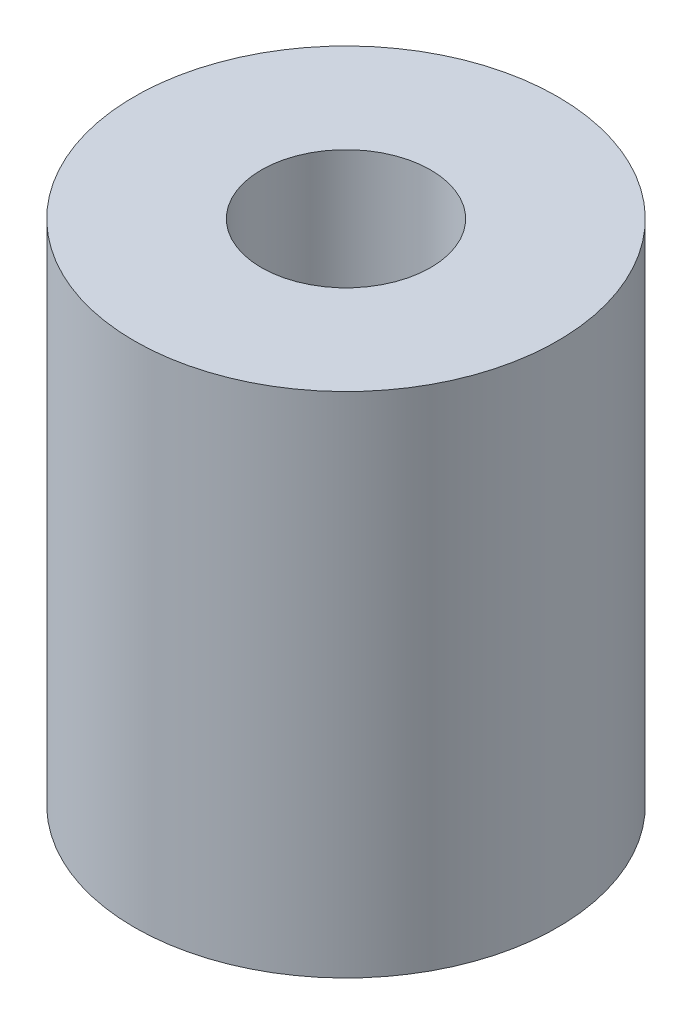
ISO-10303-21;
HEADER;
FILE_DESCRIPTION(('STEP AP214'),'2;1');
FILE_NAME('part.step','',(''),(''),'','','');
FILE_SCHEMA(('AUTOMOTIVE_DESIGN { 1 0 10303 214 1 1 1 1 }'));
ENDSEC;
DATA;
#1=APPLICATION_CONTEXT('core data for automotive mechanical design processes');
#2=APPLICATION_PROTOCOL_DEFINITION('international standard','automotive_design',2000,#1);
#3=PRODUCT_CONTEXT('',#1,'mechanical');
#4=PRODUCT('Part','Part','',(#3));
#5=PRODUCT_RELATED_PRODUCT_CATEGORY('part','',(#4));
#6=PRODUCT_DEFINITION_FORMATION('','',#4);
#7=PRODUCT_DEFINITION_CONTEXT('part definition',#1,'design');
#8=PRODUCT_DEFINITION('design','',#6,#7);
#9=PRODUCT_DEFINITION_SHAPE('','',#8);
#10=(LENGTH_UNIT() NAMED_UNIT(*) SI_UNIT(.MILLI.,.METRE.));
#11=(NAMED_UNIT(*) PLANE_ANGLE_UNIT() SI_UNIT($,.RADIAN.));
#12=(NAMED_UNIT(*) SI_UNIT($,.STERADIAN.) SOLID_ANGLE_UNIT());
#13=UNCERTAINTY_MEASURE_WITH_UNIT(LENGTH_MEASURE(1.E-05),#10,'distance_accuracy_value','');
#14=(GEOMETRIC_REPRESENTATION_CONTEXT(3) GLOBAL_UNCERTAINTY_ASSIGNED_CONTEXT((#13)) GLOBAL_UNIT_ASSIGNED_CONTEXT((#10,
#11,#12)) REPRESENTATION_CONTEXT('',''));
#15=CARTESIAN_POINT('',(0.,0.,0.));
#16=DIRECTION('',(0.,0.,1.));
#17=DIRECTION('',(1.,0.,0.));
#18=AXIS2_PLACEMENT_3D('',#15,#16,#17);
#19=CARTESIAN_POINT('',(0.,12.,0.));
#20=DIRECTION('',(0.,-1.,0.));
#21=DIRECTION('',(0.,0.,-1.));
#22=AXIS2_PLACEMENT_3D('',#19,#20,#21);
#23=CYLINDRICAL_SURFACE('',#22,5.);
#24=CARTESIAN_POINT('',(0.,12.,0.));
#25=DIRECTION('',(0.,1.,0.));
#26=DIRECTION('',(0.,0.,1.));
#27=AXIS2_PLACEMENT_3D('',#24,#25,#26);
#28=CIRCLE('',#27,5.);
#29=CARTESIAN_POINT('',(0.,12.,5.));
#30=VERTEX_POINT('',#29);
#31=EDGE_CURVE('E10',#30,#30,#28,.T.);
#32=ORIENTED_EDGE('',*,*,#31,.F.);
#33=EDGE_LOOP('',(#32));
#34=FACE_BOUND('',#33,.T.);
#35=CARTESIAN_POINT('',(0.,0.,0.));
#36=DIRECTION('',(0.,1.,0.));
#37=DIRECTION('',(0.,0.,1.));
#38=AXIS2_PLACEMENT_3D('',#35,#36,#37);
#39=CIRCLE('',#38,5.);
#40=CARTESIAN_POINT('',(0.,0.,5.));
#41=VERTEX_POINT('',#40);
#42=EDGE_CURVE('E34',#41,#41,#39,.T.);
#43=ORIENTED_EDGE('',*,*,#42,.T.);
#44=EDGE_LOOP('',(#43));
#45=FACE_BOUND('',#44,.T.);
#46=ADVANCED_FACE('F31',(#34,#45),#23,.T.);
#47=CARTESIAN_POINT('',(0.,12.,0.));
#48=DIRECTION('',(0.,1.,0.));
#49=DIRECTION('',(0.,0.,1.));
#50=AXIS2_PLACEMENT_3D('',#47,#48,#49);
#51=PLANE('',#50);
#52=CARTESIAN_POINT('',(0.,12.,0.));
#53=DIRECTION('',(0.,1.,0.));
#54=DIRECTION('',(0.,0.,1.));
#55=AXIS2_PLACEMENT_3D('',#52,#53,#54);
#56=CIRCLE('',#55,2.);
#57=CARTESIAN_POINT('',(0.,12.,2.));
#58=VERTEX_POINT('',#57);
#59=EDGE_CURVE('E45',#58,#58,#56,.T.);
#60=ORIENTED_EDGE('',*,*,#59,.F.);
#61=EDGE_LOOP('',(#60));
#62=FACE_BOUND('',#61,.T.);
#63=ORIENTED_EDGE('',*,*,#31,.T.);
#64=EDGE_LOOP('',(#63));
#65=FACE_BOUND('',#64,.T.);
#66=ADVANCED_FACE('F52',(#62,#65),#51,.T.);
#67=CARTESIAN_POINT('',(0.,0.,0.));
#68=DIRECTION('',(0.,1.,0.));
#69=DIRECTION('',(0.,0.,1.));
#70=AXIS2_PLACEMENT_3D('',#67,#68,#69);
#71=PLANE('',#70);
#72=CARTESIAN_POINT('',(0.,0.,0.));
#73=DIRECTION('',(0.,1.,0.));
#74=DIRECTION('',(0.,0.,1.));
#75=AXIS2_PLACEMENT_3D('',#72,#73,#74);
#76=CIRCLE('',#75,2.);
#77=CARTESIAN_POINT('',(0.,0.,2.));
#78=VERTEX_POINT('',#77);
#79=EDGE_CURVE('E41',#78,#78,#76,.F.);
#80=ORIENTED_EDGE('',*,*,#79,.F.);
#81=EDGE_LOOP('',(#80));
#82=FACE_BOUND('',#81,.T.);
#83=ORIENTED_EDGE('',*,*,#42,.F.);
#84=EDGE_LOOP('',(#83));
#85=FACE_BOUND('',#84,.T.);
#86=ADVANCED_FACE('F54',(#82,#85),#71,.F.);
#87=CARTESIAN_POINT('',(0.,-0.000999999999999265,0.));
#88=DIRECTION('',(0.,1.,0.));
#89=DIRECTION('',(0.,0.,1.));
#90=AXIS2_PLACEMENT_3D('',#87,#88,#89);
#91=CYLINDRICAL_SURFACE('',#90,2.);
#92=ORIENTED_EDGE('',*,*,#59,.T.);
#93=EDGE_LOOP('',(#92));
#94=FACE_BOUND('',#93,.T.);
#95=ORIENTED_EDGE('',*,*,#79,.T.);
#96=EDGE_LOOP('',(#95));
#97=FACE_BOUND('',#96,.T.);
#98=ADVANCED_FACE('F49',(#94,#97),#91,.F.);
#99=CLOSED_SHELL('',(#46,#66,#86,#98));
#100=MANIFOLD_SOLID_BREP('B2',#99);
#101=ADVANCED_BREP_SHAPE_REPRESENTATION('',(#18,#100),#14);
#102=SHAPE_DEFINITION_REPRESENTATION(#9,#101);
ENDSEC;
END-ISO-10303-21;
